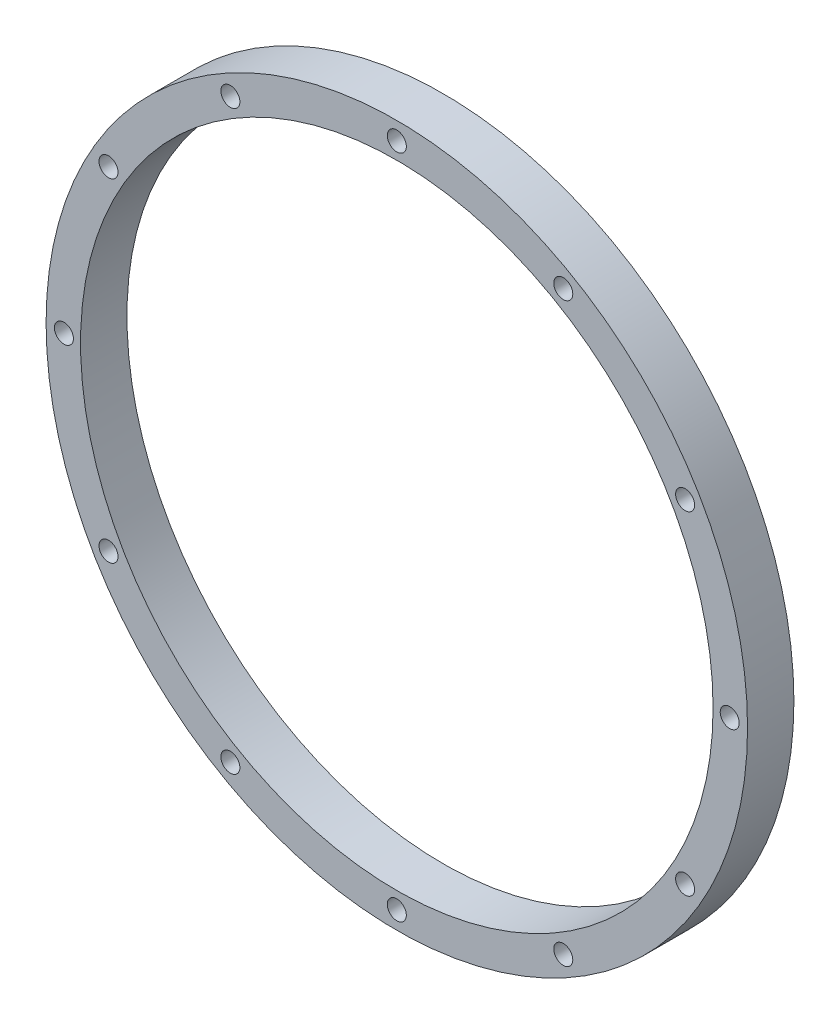
ISO-10303-21;
HEADER;
FILE_DESCRIPTION(('STEP AP214'),'2;1');
FILE_NAME('part.step','',(''),(''),'','','');
FILE_SCHEMA(('AUTOMOTIVE_DESIGN { 1 0 10303 214 1 1 1 1 }'));
ENDSEC;
DATA;
#1=APPLICATION_CONTEXT('core data for automotive mechanical design processes');
#2=APPLICATION_PROTOCOL_DEFINITION('international standard','automotive_design',2000,#1);
#3=PRODUCT_CONTEXT('',#1,'mechanical');
#4=PRODUCT('Part','Part','',(#3));
#5=PRODUCT_RELATED_PRODUCT_CATEGORY('part','',(#4));
#6=PRODUCT_DEFINITION_FORMATION('','',#4);
#7=PRODUCT_DEFINITION_CONTEXT('part definition',#1,'design');
#8=PRODUCT_DEFINITION('design','',#6,#7);
#9=PRODUCT_DEFINITION_SHAPE('','',#8);
#10=(LENGTH_UNIT() NAMED_UNIT(*) SI_UNIT(.MILLI.,.METRE.));
#11=(NAMED_UNIT(*) PLANE_ANGLE_UNIT() SI_UNIT($,.RADIAN.));
#12=(NAMED_UNIT(*) SI_UNIT($,.STERADIAN.) SOLID_ANGLE_UNIT());
#13=UNCERTAINTY_MEASURE_WITH_UNIT(LENGTH_MEASURE(1.E-05),#10,'distance_accuracy_value','');
#14=(GEOMETRIC_REPRESENTATION_CONTEXT(3) GLOBAL_UNCERTAINTY_ASSIGNED_CONTEXT((#13)) GLOBAL_UNIT_ASSIGNED_CONTEXT((#10,
#11,#12)) REPRESENTATION_CONTEXT('',''));
#15=CARTESIAN_POINT('',(0.,0.,0.));
#16=DIRECTION('',(0.,0.,1.));
#17=DIRECTION('',(1.,0.,0.));
#18=AXIS2_PLACEMENT_3D('',#15,#16,#17);
#19=CARTESIAN_POINT('',(0.,0.,7.8));
#20=DIRECTION('',(0.,0.,1.));
#21=DIRECTION('',(1.,0.,0.));
#22=AXIS2_PLACEMENT_3D('',#19,#20,#21);
#23=PLANE('',#22);
#24=CARTESIAN_POINT('',(-48.4974226119286,28.,7.8));
#25=DIRECTION('',(0.,0.,1.));
#26=DIRECTION('',(1.,0.,0.));
#27=AXIS2_PLACEMENT_3D('',#24,#25,#26);
#28=CIRCLE('',#27,1.6);
#29=CARTESIAN_POINT('',(-46.8974226119286,28.,7.8));
#30=VERTEX_POINT('',#29);
#31=EDGE_CURVE('E110',#30,#30,#28,.T.);
#32=ORIENTED_EDGE('',*,*,#31,.F.);
#33=EDGE_LOOP('',(#32));
#34=FACE_BOUND('',#33,.T.);
#35=CARTESIAN_POINT('',(-48.4974226119286,-28.,7.8));
#36=DIRECTION('',(0.,0.,1.));
#37=DIRECTION('',(1.,0.,0.));
#38=AXIS2_PLACEMENT_3D('',#35,#36,#37);
#39=CIRCLE('',#38,1.6);
#40=CARTESIAN_POINT('',(-46.8974226119286,-28.,7.8));
#41=VERTEX_POINT('',#40);
#42=EDGE_CURVE('E98',#41,#41,#39,.T.);
#43=ORIENTED_EDGE('',*,*,#42,.F.);
#44=EDGE_LOOP('',(#43));
#45=FACE_BOUND('',#44,.T.);
#46=CARTESIAN_POINT('',(0.,-56.,7.8));
#47=DIRECTION('',(0.,0.,1.));
#48=DIRECTION('',(1.,0.,0.));
#49=AXIS2_PLACEMENT_3D('',#46,#47,#48);
#50=CIRCLE('',#49,1.6);
#51=CARTESIAN_POINT('',(1.60000000000001,-56.,7.8));
#52=VERTEX_POINT('',#51);
#53=EDGE_CURVE('E86',#52,#52,#50,.T.);
#54=ORIENTED_EDGE('',*,*,#53,.F.);
#55=EDGE_LOOP('',(#54));
#56=FACE_BOUND('',#55,.T.);
#57=CARTESIAN_POINT('',(48.4974226119286,-28.,7.8));
#58=DIRECTION('',(0.,0.,1.));
#59=DIRECTION('',(1.,0.,0.));
#60=AXIS2_PLACEMENT_3D('',#57,#58,#59);
#61=CIRCLE('',#60,1.60000000000019);
#62=CARTESIAN_POINT('',(50.0974226119288,-28.,7.8));
#63=VERTEX_POINT('',#62);
#64=EDGE_CURVE('E74',#63,#63,#61,.T.);
#65=ORIENTED_EDGE('',*,*,#64,.F.);
#66=EDGE_LOOP('',(#65));
#67=FACE_BOUND('',#66,.T.);
#68=CARTESIAN_POINT('',(48.4974226119286,28.,7.8));
#69=DIRECTION('',(0.,0.,1.));
#70=DIRECTION('',(1.,0.,0.));
#71=AXIS2_PLACEMENT_3D('',#68,#69,#70);
#72=CIRCLE('',#71,1.60000000000009);
#73=CARTESIAN_POINT('',(50.0974226119286,28.,7.8));
#74=VERTEX_POINT('',#73);
#75=EDGE_CURVE('E62',#74,#74,#72,.T.);
#76=ORIENTED_EDGE('',*,*,#75,.F.);
#77=EDGE_LOOP('',(#76));
#78=FACE_BOUND('',#77,.T.);
#79=CARTESIAN_POINT('',(0.,56.,7.8));
#80=DIRECTION('',(0.,0.,1.));
#81=DIRECTION('',(1.,0.,0.));
#82=AXIS2_PLACEMENT_3D('',#79,#80,#81);
#83=CIRCLE('',#82,1.6);
#84=CARTESIAN_POINT('',(1.6,56.,7.8));
#85=VERTEX_POINT('',#84);
#86=EDGE_CURVE('E50',#85,#85,#83,.T.);
#87=ORIENTED_EDGE('',*,*,#86,.F.);
#88=EDGE_LOOP('',(#87));
#89=FACE_BOUND('',#88,.T.);
#90=CARTESIAN_POINT('',(0.,0.,7.8));
#91=DIRECTION('',(0.,0.,1.));
#92=DIRECTION('',(1.,0.,0.));
#93=AXIS2_PLACEMENT_3D('',#90,#91,#92);
#94=CIRCLE('',#93,59.);
#95=CARTESIAN_POINT('',(59.,0.,7.8));
#96=VERTEX_POINT('',#95);
#97=EDGE_CURVE('E10',#96,#96,#94,.T.);
#98=ORIENTED_EDGE('',*,*,#97,.T.);
#99=EDGE_LOOP('',(#98));
#100=FACE_BOUND('',#99,.T.);
#101=CARTESIAN_POINT('',(0.,0.,7.8));
#102=DIRECTION('',(0.,0.,1.));
#103=DIRECTION('',(1.,0.,0.));
#104=AXIS2_PLACEMENT_3D('',#101,#102,#103);
#105=CIRCLE('',#104,53.2);
#106=CARTESIAN_POINT('',(53.2,0.,7.8));
#107=VERTEX_POINT('',#106);
#108=EDGE_CURVE('E45',#107,#107,#105,.T.);
#109=ORIENTED_EDGE('',*,*,#108,.F.);
#110=EDGE_LOOP('',(#109));
#111=FACE_BOUND('',#110,.T.);
#112=CARTESIAN_POINT('',(28.,48.4974226119286,7.8));
#113=DIRECTION('',(0.,0.,1.));
#114=DIRECTION('',(1.,0.,0.));
#115=AXIS2_PLACEMENT_3D('',#112,#113,#114);
#116=CIRCLE('',#115,1.6);
#117=CARTESIAN_POINT('',(29.6,48.4974226119286,7.8));
#118=VERTEX_POINT('',#117);
#119=EDGE_CURVE('E56',#118,#118,#116,.T.);
#120=ORIENTED_EDGE('',*,*,#119,.F.);
#121=EDGE_LOOP('',(#120));
#122=FACE_BOUND('',#121,.T.);
#123=CARTESIAN_POINT('',(56.,0.,7.8));
#124=DIRECTION('',(0.,0.,1.));
#125=DIRECTION('',(1.,0.,0.));
#126=AXIS2_PLACEMENT_3D('',#123,#124,#125);
#127=CIRCLE('',#126,1.60000000000014);
#128=CARTESIAN_POINT('',(57.6000000000001,0.,7.8));
#129=VERTEX_POINT('',#128);
#130=EDGE_CURVE('E68',#129,#129,#127,.T.);
#131=ORIENTED_EDGE('',*,*,#130,.F.);
#132=EDGE_LOOP('',(#131));
#133=FACE_BOUND('',#132,.T.);
#134=CARTESIAN_POINT('',(28.,-48.4974226119286,7.8));
#135=DIRECTION('',(0.,0.,1.));
#136=DIRECTION('',(1.,0.,0.));
#137=AXIS2_PLACEMENT_3D('',#134,#135,#136);
#138=CIRCLE('',#137,1.6);
#139=CARTESIAN_POINT('',(29.6,-48.4974226119286,7.8));
#140=VERTEX_POINT('',#139);
#141=EDGE_CURVE('E80',#140,#140,#138,.T.);
#142=ORIENTED_EDGE('',*,*,#141,.F.);
#143=EDGE_LOOP('',(#142));
#144=FACE_BOUND('',#143,.T.);
#145=CARTESIAN_POINT('',(-28.,-48.4974226119286,7.8));
#146=DIRECTION('',(0.,0.,1.));
#147=DIRECTION('',(1.,0.,0.));
#148=AXIS2_PLACEMENT_3D('',#145,#146,#147);
#149=CIRCLE('',#148,1.6);
#150=CARTESIAN_POINT('',(-26.4,-48.4974226119286,7.8));
#151=VERTEX_POINT('',#150);
#152=EDGE_CURVE('E92',#151,#151,#149,.T.);
#153=ORIENTED_EDGE('',*,*,#152,.F.);
#154=EDGE_LOOP('',(#153));
#155=FACE_BOUND('',#154,.T.);
#156=CARTESIAN_POINT('',(-56.,0.,7.8));
#157=DIRECTION('',(0.,0.,1.));
#158=DIRECTION('',(1.,0.,0.));
#159=AXIS2_PLACEMENT_3D('',#156,#157,#158);
#160=CIRCLE('',#159,1.6);
#161=CARTESIAN_POINT('',(-54.4,0.,7.8));
#162=VERTEX_POINT('',#161);
#163=EDGE_CURVE('E104',#162,#162,#160,.T.);
#164=ORIENTED_EDGE('',*,*,#163,.F.);
#165=EDGE_LOOP('',(#164));
#166=FACE_BOUND('',#165,.T.);
#167=CARTESIAN_POINT('',(-28.,48.4974226119285,7.8));
#168=DIRECTION('',(0.,0.,1.));
#169=DIRECTION('',(1.,0.,0.));
#170=AXIS2_PLACEMENT_3D('',#167,#168,#169);
#171=CIRCLE('',#170,1.6);
#172=CARTESIAN_POINT('',(-26.4,48.4974226119285,7.8));
#173=VERTEX_POINT('',#172);
#174=EDGE_CURVE('E116',#173,#173,#171,.T.);
#175=ORIENTED_EDGE('',*,*,#174,.F.);
#176=EDGE_LOOP('',(#175));
#177=FACE_BOUND('',#176,.T.);
#178=ADVANCED_FACE('F34',(#34,#45,#56,#67,#78,#89,#100,#111,#122,#133,#144,#155,#166,#177),#23,.T.);
#179=CARTESIAN_POINT('',(0.,0.,0.));
#180=DIRECTION('',(0.,0.,1.));
#181=DIRECTION('',(1.,0.,0.));
#182=AXIS2_PLACEMENT_3D('',#179,#180,#181);
#183=PLANE('',#182);
#184=CARTESIAN_POINT('',(0.,0.,0.));
#185=DIRECTION('',(0.,0.,1.));
#186=DIRECTION('',(1.,0.,0.));
#187=AXIS2_PLACEMENT_3D('',#184,#185,#186);
#188=CIRCLE('',#187,59.);
#189=CARTESIAN_POINT('',(59.,0.,0.));
#190=VERTEX_POINT('',#189);
#191=EDGE_CURVE('E38',#190,#190,#188,.T.);
#192=ORIENTED_EDGE('',*,*,#191,.F.);
#193=EDGE_LOOP('',(#192));
#194=FACE_BOUND('',#193,.T.);
#195=CARTESIAN_POINT('',(0.,0.,0.));
#196=DIRECTION('',(0.,0.,1.));
#197=DIRECTION('',(1.,0.,0.));
#198=AXIS2_PLACEMENT_3D('',#195,#196,#197);
#199=CIRCLE('',#198,53.2);
#200=CARTESIAN_POINT('',(53.2,0.,0.));
#201=VERTEX_POINT('',#200);
#202=EDGE_CURVE('E47',#201,#201,#199,.T.);
#203=ORIENTED_EDGE('',*,*,#202,.T.);
#204=EDGE_LOOP('',(#203));
#205=FACE_BOUND('',#204,.T.);
#206=CARTESIAN_POINT('',(0.,56.,0.));
#207=DIRECTION('',(0.,0.,1.));
#208=DIRECTION('',(1.,0.,0.));
#209=AXIS2_PLACEMENT_3D('',#206,#207,#208);
#210=CIRCLE('',#209,1.6);
#211=CARTESIAN_POINT('',(1.6,56.,0.));
#212=VERTEX_POINT('',#211);
#213=EDGE_CURVE('E53',#212,#212,#210,.T.);
#214=ORIENTED_EDGE('',*,*,#213,.T.);
#215=EDGE_LOOP('',(#214));
#216=FACE_BOUND('',#215,.T.);
#217=CARTESIAN_POINT('',(28.,48.4974226119286,0.));
#218=DIRECTION('',(0.,0.,1.));
#219=DIRECTION('',(1.,0.,0.));
#220=AXIS2_PLACEMENT_3D('',#217,#218,#219);
#221=CIRCLE('',#220,1.6);
#222=CARTESIAN_POINT('',(29.6,48.4974226119286,0.));
#223=VERTEX_POINT('',#222);
#224=EDGE_CURVE('E59',#223,#223,#221,.T.);
#225=ORIENTED_EDGE('',*,*,#224,.T.);
#226=EDGE_LOOP('',(#225));
#227=FACE_BOUND('',#226,.T.);
#228=CARTESIAN_POINT('',(48.4974226119286,28.,0.));
#229=DIRECTION('',(0.,0.,1.));
#230=DIRECTION('',(1.,0.,0.));
#231=AXIS2_PLACEMENT_3D('',#228,#229,#230);
#232=CIRCLE('',#231,1.60000000000009);
#233=CARTESIAN_POINT('',(50.0974226119286,28.,0.));
#234=VERTEX_POINT('',#233);
#235=EDGE_CURVE('E65',#234,#234,#232,.T.);
#236=ORIENTED_EDGE('',*,*,#235,.T.);
#237=EDGE_LOOP('',(#236));
#238=FACE_BOUND('',#237,.T.);
#239=CARTESIAN_POINT('',(56.,0.,0.));
#240=DIRECTION('',(0.,0.,1.));
#241=DIRECTION('',(1.,0.,0.));
#242=AXIS2_PLACEMENT_3D('',#239,#240,#241);
#243=CIRCLE('',#242,1.60000000000014);
#244=CARTESIAN_POINT('',(57.6000000000001,0.,0.));
#245=VERTEX_POINT('',#244);
#246=EDGE_CURVE('E71',#245,#245,#243,.T.);
#247=ORIENTED_EDGE('',*,*,#246,.T.);
#248=EDGE_LOOP('',(#247));
#249=FACE_BOUND('',#248,.T.);
#250=CARTESIAN_POINT('',(48.4974226119286,-28.,0.));
#251=DIRECTION('',(0.,0.,1.));
#252=DIRECTION('',(1.,0.,0.));
#253=AXIS2_PLACEMENT_3D('',#250,#251,#252);
#254=CIRCLE('',#253,1.60000000000019);
#255=CARTESIAN_POINT('',(50.0974226119288,-28.,0.));
#256=VERTEX_POINT('',#255);
#257=EDGE_CURVE('E77',#256,#256,#254,.T.);
#258=ORIENTED_EDGE('',*,*,#257,.T.);
#259=EDGE_LOOP('',(#258));
#260=FACE_BOUND('',#259,.T.);
#261=CARTESIAN_POINT('',(28.,-48.4974226119286,0.));
#262=DIRECTION('',(0.,0.,1.));
#263=DIRECTION('',(1.,0.,0.));
#264=AXIS2_PLACEMENT_3D('',#261,#262,#263);
#265=CIRCLE('',#264,1.6);
#266=CARTESIAN_POINT('',(29.6,-48.4974226119286,0.));
#267=VERTEX_POINT('',#266);
#268=EDGE_CURVE('E83',#267,#267,#265,.T.);
#269=ORIENTED_EDGE('',*,*,#268,.T.);
#270=EDGE_LOOP('',(#269));
#271=FACE_BOUND('',#270,.T.);
#272=CARTESIAN_POINT('',(0.,-56.,0.));
#273=DIRECTION('',(0.,0.,1.));
#274=DIRECTION('',(1.,0.,0.));
#275=AXIS2_PLACEMENT_3D('',#272,#273,#274);
#276=CIRCLE('',#275,1.6);
#277=CARTESIAN_POINT('',(1.60000000000001,-56.,0.));
#278=VERTEX_POINT('',#277);
#279=EDGE_CURVE('E89',#278,#278,#276,.T.);
#280=ORIENTED_EDGE('',*,*,#279,.T.);
#281=EDGE_LOOP('',(#280));
#282=FACE_BOUND('',#281,.T.);
#283=CARTESIAN_POINT('',(-28.,-48.4974226119286,0.));
#284=DIRECTION('',(0.,0.,1.));
#285=DIRECTION('',(1.,0.,0.));
#286=AXIS2_PLACEMENT_3D('',#283,#284,#285);
#287=CIRCLE('',#286,1.6);
#288=CARTESIAN_POINT('',(-26.4,-48.4974226119286,0.));
#289=VERTEX_POINT('',#288);
#290=EDGE_CURVE('E95',#289,#289,#287,.T.);
#291=ORIENTED_EDGE('',*,*,#290,.T.);
#292=EDGE_LOOP('',(#291));
#293=FACE_BOUND('',#292,.T.);
#294=CARTESIAN_POINT('',(-48.4974226119286,-28.,0.));
#295=DIRECTION('',(0.,0.,1.));
#296=DIRECTION('',(1.,0.,0.));
#297=AXIS2_PLACEMENT_3D('',#294,#295,#296);
#298=CIRCLE('',#297,1.6);
#299=CARTESIAN_POINT('',(-46.8974226119286,-28.,0.));
#300=VERTEX_POINT('',#299);
#301=EDGE_CURVE('E101',#300,#300,#298,.T.);
#302=ORIENTED_EDGE('',*,*,#301,.T.);
#303=EDGE_LOOP('',(#302));
#304=FACE_BOUND('',#303,.T.);
#305=CARTESIAN_POINT('',(-56.,0.,0.));
#306=DIRECTION('',(0.,0.,1.));
#307=DIRECTION('',(1.,0.,0.));
#308=AXIS2_PLACEMENT_3D('',#305,#306,#307);
#309=CIRCLE('',#308,1.6);
#310=CARTESIAN_POINT('',(-54.4,0.,0.));
#311=VERTEX_POINT('',#310);
#312=EDGE_CURVE('E107',#311,#311,#309,.T.);
#313=ORIENTED_EDGE('',*,*,#312,.T.);
#314=EDGE_LOOP('',(#313));
#315=FACE_BOUND('',#314,.T.);
#316=CARTESIAN_POINT('',(-48.4974226119286,28.,0.));
#317=DIRECTION('',(0.,0.,1.));
#318=DIRECTION('',(1.,0.,0.));
#319=AXIS2_PLACEMENT_3D('',#316,#317,#318);
#320=CIRCLE('',#319,1.6);
#321=CARTESIAN_POINT('',(-46.8974226119286,28.,0.));
#322=VERTEX_POINT('',#321);
#323=EDGE_CURVE('E113',#322,#322,#320,.T.);
#324=ORIENTED_EDGE('',*,*,#323,.T.);
#325=EDGE_LOOP('',(#324));
#326=FACE_BOUND('',#325,.T.);
#327=CARTESIAN_POINT('',(-28.,48.4974226119285,0.));
#328=DIRECTION('',(0.,0.,1.));
#329=DIRECTION('',(1.,0.,0.));
#330=AXIS2_PLACEMENT_3D('',#327,#328,#329);
#331=CIRCLE('',#330,1.6);
#332=CARTESIAN_POINT('',(-26.4,48.4974226119285,0.));
#333=VERTEX_POINT('',#332);
#334=EDGE_CURVE('E119',#333,#333,#331,.T.);
#335=ORIENTED_EDGE('',*,*,#334,.T.);
#336=EDGE_LOOP('',(#335));
#337=FACE_BOUND('',#336,.T.);
#338=ADVANCED_FACE('F129',(#194,#205,#216,#227,#238,#249,#260,#271,#282,#293,#304,#315,#326,
#337),#183,.F.);
#339=CARTESIAN_POINT('',(0.,0.,7.8));
#340=DIRECTION('',(0.,0.,-1.));
#341=DIRECTION('',(-1.,0.,0.));
#342=AXIS2_PLACEMENT_3D('',#339,#340,#341);
#343=CYLINDRICAL_SURFACE('',#342,59.);
#344=ORIENTED_EDGE('',*,*,#97,.F.);
#345=EDGE_LOOP('',(#344));
#346=FACE_BOUND('',#345,.T.);
#347=ORIENTED_EDGE('',*,*,#191,.T.);
#348=EDGE_LOOP('',(#347));
#349=FACE_BOUND('',#348,.T.);
#350=ADVANCED_FACE('F36',(#346,#349),#343,.T.);
#351=CARTESIAN_POINT('',(0.,0.,7.8));
#352=DIRECTION('',(0.,0.,-1.));
#353=DIRECTION('',(-1.,0.,0.));
#354=AXIS2_PLACEMENT_3D('',#351,#352,#353);
#355=CYLINDRICAL_SURFACE('',#354,53.2);
#356=ORIENTED_EDGE('',*,*,#108,.T.);
#357=EDGE_LOOP('',(#356));
#358=FACE_BOUND('',#357,.T.);
#359=ORIENTED_EDGE('',*,*,#202,.F.);
#360=EDGE_LOOP('',(#359));
#361=FACE_BOUND('',#360,.T.);
#362=ADVANCED_FACE('F139',(#358,#361),#355,.F.);
#363=CARTESIAN_POINT('',(0.,56.,7.8));
#364=DIRECTION('',(0.,0.,-1.));
#365=DIRECTION('',(-1.,0.,0.));
#366=AXIS2_PLACEMENT_3D('',#363,#364,#365);
#367=CYLINDRICAL_SURFACE('',#366,1.6);
#368=ORIENTED_EDGE('',*,*,#86,.T.);
#369=EDGE_LOOP('',(#368));
#370=FACE_BOUND('',#369,.T.);
#371=ORIENTED_EDGE('',*,*,#213,.F.);
#372=EDGE_LOOP('',(#371));
#373=FACE_BOUND('',#372,.T.);
#374=ADVANCED_FACE('F142',(#370,#373),#367,.F.);
#375=CARTESIAN_POINT('',(28.,48.4974226119286,7.8));
#376=DIRECTION('',(0.,0.,-1.));
#377=DIRECTION('',(-1.,0.,0.));
#378=AXIS2_PLACEMENT_3D('',#375,#376,#377);
#379=CYLINDRICAL_SURFACE('',#378,1.6);
#380=ORIENTED_EDGE('',*,*,#119,.T.);
#381=EDGE_LOOP('',(#380));
#382=FACE_BOUND('',#381,.T.);
#383=ORIENTED_EDGE('',*,*,#224,.F.);
#384=EDGE_LOOP('',(#383));
#385=FACE_BOUND('',#384,.T.);
#386=ADVANCED_FACE('F146',(#382,#385),#379,.F.);
#387=CARTESIAN_POINT('',(48.4974226119286,28.,7.8));
#388=DIRECTION('',(0.,0.,-1.));
#389=DIRECTION('',(-1.,0.,0.));
#390=AXIS2_PLACEMENT_3D('',#387,#388,#389);
#391=CYLINDRICAL_SURFACE('',#390,1.60000000000009);
#392=ORIENTED_EDGE('',*,*,#75,.T.);
#393=EDGE_LOOP('',(#392));
#394=FACE_BOUND('',#393,.T.);
#395=ORIENTED_EDGE('',*,*,#235,.F.);
#396=EDGE_LOOP('',(#395));
#397=FACE_BOUND('',#396,.T.);
#398=ADVANCED_FACE('F150',(#394,#397),#391,.F.);
#399=CARTESIAN_POINT('',(56.,0.,7.8));
#400=DIRECTION('',(0.,0.,-1.));
#401=DIRECTION('',(-1.,0.,0.));
#402=AXIS2_PLACEMENT_3D('',#399,#400,#401);
#403=CYLINDRICAL_SURFACE('',#402,1.60000000000014);
#404=ORIENTED_EDGE('',*,*,#130,.T.);
#405=EDGE_LOOP('',(#404));
#406=FACE_BOUND('',#405,.T.);
#407=ORIENTED_EDGE('',*,*,#246,.F.);
#408=EDGE_LOOP('',(#407));
#409=FACE_BOUND('',#408,.T.);
#410=ADVANCED_FACE('F154',(#406,#409),#403,.F.);
#411=CARTESIAN_POINT('',(48.4974226119286,-28.,7.8));
#412=DIRECTION('',(0.,0.,-1.));
#413=DIRECTION('',(-1.,0.,0.));
#414=AXIS2_PLACEMENT_3D('',#411,#412,#413);
#415=CYLINDRICAL_SURFACE('',#414,1.60000000000019);
#416=ORIENTED_EDGE('',*,*,#64,.T.);
#417=EDGE_LOOP('',(#416));
#418=FACE_BOUND('',#417,.T.);
#419=ORIENTED_EDGE('',*,*,#257,.F.);
#420=EDGE_LOOP('',(#419));
#421=FACE_BOUND('',#420,.T.);
#422=ADVANCED_FACE('F158',(#418,#421),#415,.F.);
#423=CARTESIAN_POINT('',(28.,-48.4974226119286,7.8));
#424=DIRECTION('',(0.,0.,-1.));
#425=DIRECTION('',(-1.,0.,0.));
#426=AXIS2_PLACEMENT_3D('',#423,#424,#425);
#427=CYLINDRICAL_SURFACE('',#426,1.6);
#428=ORIENTED_EDGE('',*,*,#141,.T.);
#429=EDGE_LOOP('',(#428));
#430=FACE_BOUND('',#429,.T.);
#431=ORIENTED_EDGE('',*,*,#268,.F.);
#432=EDGE_LOOP('',(#431));
#433=FACE_BOUND('',#432,.T.);
#434=ADVANCED_FACE('F162',(#430,#433),#427,.F.);
#435=CARTESIAN_POINT('',(0.,-56.,7.8));
#436=DIRECTION('',(0.,0.,-1.));
#437=DIRECTION('',(-1.,0.,0.));
#438=AXIS2_PLACEMENT_3D('',#435,#436,#437);
#439=CYLINDRICAL_SURFACE('',#438,1.6);
#440=ORIENTED_EDGE('',*,*,#53,.T.);
#441=EDGE_LOOP('',(#440));
#442=FACE_BOUND('',#441,.T.);
#443=ORIENTED_EDGE('',*,*,#279,.F.);
#444=EDGE_LOOP('',(#443));
#445=FACE_BOUND('',#444,.T.);
#446=ADVANCED_FACE('F166',(#442,#445),#439,.F.);
#447=CARTESIAN_POINT('',(-28.,-48.4974226119286,7.8));
#448=DIRECTION('',(0.,0.,-1.));
#449=DIRECTION('',(-1.,0.,0.));
#450=AXIS2_PLACEMENT_3D('',#447,#448,#449);
#451=CYLINDRICAL_SURFACE('',#450,1.6);
#452=ORIENTED_EDGE('',*,*,#152,.T.);
#453=EDGE_LOOP('',(#452));
#454=FACE_BOUND('',#453,.T.);
#455=ORIENTED_EDGE('',*,*,#290,.F.);
#456=EDGE_LOOP('',(#455));
#457=FACE_BOUND('',#456,.T.);
#458=ADVANCED_FACE('F170',(#454,#457),#451,.F.);
#459=CARTESIAN_POINT('',(-48.4974226119286,-28.,7.8));
#460=DIRECTION('',(0.,0.,-1.));
#461=DIRECTION('',(-1.,0.,0.));
#462=AXIS2_PLACEMENT_3D('',#459,#460,#461);
#463=CYLINDRICAL_SURFACE('',#462,1.6);
#464=ORIENTED_EDGE('',*,*,#42,.T.);
#465=EDGE_LOOP('',(#464));
#466=FACE_BOUND('',#465,.T.);
#467=ORIENTED_EDGE('',*,*,#301,.F.);
#468=EDGE_LOOP('',(#467));
#469=FACE_BOUND('',#468,.T.);
#470=ADVANCED_FACE('F174',(#466,#469),#463,.F.);
#471=CARTESIAN_POINT('',(-56.,0.,7.8));
#472=DIRECTION('',(0.,0.,-1.));
#473=DIRECTION('',(-1.,0.,0.));
#474=AXIS2_PLACEMENT_3D('',#471,#472,#473);
#475=CYLINDRICAL_SURFACE('',#474,1.6);
#476=ORIENTED_EDGE('',*,*,#163,.T.);
#477=EDGE_LOOP('',(#476));
#478=FACE_BOUND('',#477,.T.);
#479=ORIENTED_EDGE('',*,*,#312,.F.);
#480=EDGE_LOOP('',(#479));
#481=FACE_BOUND('',#480,.T.);
#482=ADVANCED_FACE('F178',(#478,#481),#475,.F.);
#483=CARTESIAN_POINT('',(-48.4974226119286,28.,7.8));
#484=DIRECTION('',(0.,0.,-1.));
#485=DIRECTION('',(-1.,0.,0.));
#486=AXIS2_PLACEMENT_3D('',#483,#484,#485);
#487=CYLINDRICAL_SURFACE('',#486,1.6);
#488=ORIENTED_EDGE('',*,*,#31,.T.);
#489=EDGE_LOOP('',(#488));
#490=FACE_BOUND('',#489,.T.);
#491=ORIENTED_EDGE('',*,*,#323,.F.);
#492=EDGE_LOOP('',(#491));
#493=FACE_BOUND('',#492,.T.);
#494=ADVANCED_FACE('F182',(#490,#493),#487,.F.);
#495=CARTESIAN_POINT('',(-28.,48.4974226119285,7.8));
#496=DIRECTION('',(0.,0.,-1.));
#497=DIRECTION('',(-1.,0.,0.));
#498=AXIS2_PLACEMENT_3D('',#495,#496,#497);
#499=CYLINDRICAL_SURFACE('',#498,1.6);
#500=ORIENTED_EDGE('',*,*,#174,.T.);
#501=EDGE_LOOP('',(#500));
#502=FACE_BOUND('',#501,.T.);
#503=ORIENTED_EDGE('',*,*,#334,.F.);
#504=EDGE_LOOP('',(#503));
#505=FACE_BOUND('',#504,.T.);
#506=ADVANCED_FACE('F125',(#502,#505),#499,.F.);
#507=CLOSED_SHELL('',(#178,#338,#350,#362,#374,#386,#398,#410,#422,#434,#446,#458,#470,#482,
#494,#506));
#508=MANIFOLD_SOLID_BREP('B2',#507);
#509=ADVANCED_BREP_SHAPE_REPRESENTATION('',(#18,#508),#14);
#510=SHAPE_DEFINITION_REPRESENTATION(#9,#509);
ENDSEC;
END-ISO-10303-21;
